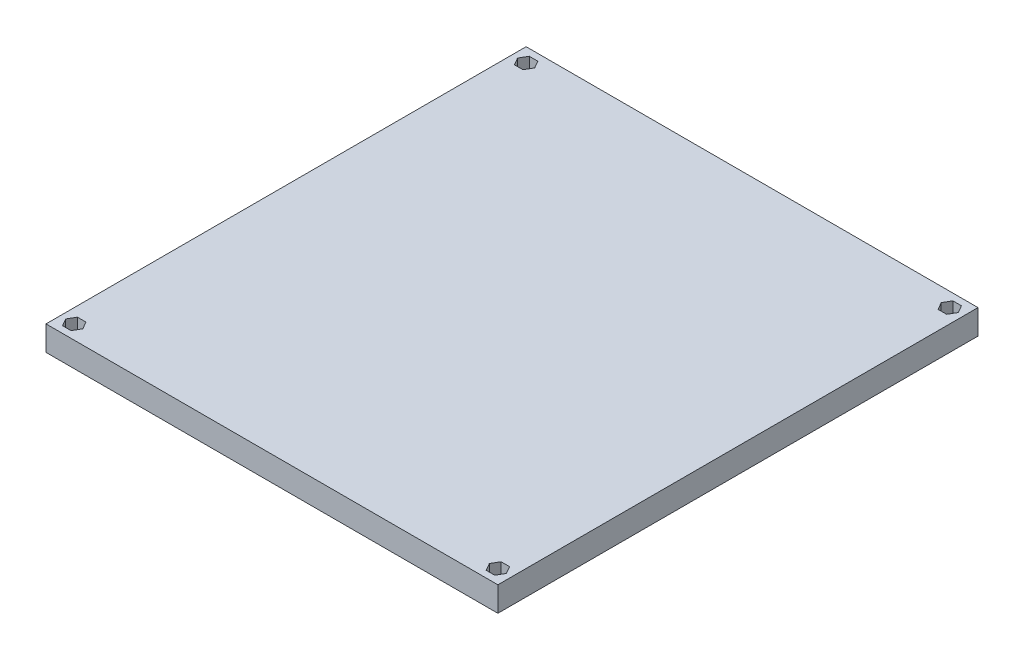
ISO-10303-21;
HEADER;
FILE_DESCRIPTION(('STEP AP214'),'2;1');
FILE_NAME('part.step','',(''),(''),'','','');
FILE_SCHEMA(('AUTOMOTIVE_DESIGN { 1 0 10303 214 1 1 1 1 }'));
ENDSEC;
DATA;
#1=APPLICATION_CONTEXT('core data for automotive mechanical design processes');
#2=APPLICATION_PROTOCOL_DEFINITION('international standard','automotive_design',2000,#1);
#3=PRODUCT_CONTEXT('',#1,'mechanical');
#4=PRODUCT('Part','Part','',(#3));
#5=PRODUCT_RELATED_PRODUCT_CATEGORY('part','',(#4));
#6=PRODUCT_DEFINITION_FORMATION('','',#4);
#7=PRODUCT_DEFINITION_CONTEXT('part definition',#1,'design');
#8=PRODUCT_DEFINITION('design','',#6,#7);
#9=PRODUCT_DEFINITION_SHAPE('','',#8);
#10=(LENGTH_UNIT() NAMED_UNIT(*) SI_UNIT(.MILLI.,.METRE.));
#11=(NAMED_UNIT(*) PLANE_ANGLE_UNIT() SI_UNIT($,.RADIAN.));
#12=(NAMED_UNIT(*) SI_UNIT($,.STERADIAN.) SOLID_ANGLE_UNIT());
#13=UNCERTAINTY_MEASURE_WITH_UNIT(LENGTH_MEASURE(1.E-05),#10,'distance_accuracy_value','');
#14=(GEOMETRIC_REPRESENTATION_CONTEXT(3) GLOBAL_UNCERTAINTY_ASSIGNED_CONTEXT((#13)) GLOBAL_UNIT_ASSIGNED_CONTEXT((#10,
#11,#12)) REPRESENTATION_CONTEXT('',''));
#15=CARTESIAN_POINT('',(0.,0.,0.));
#16=DIRECTION('',(0.,0.,1.));
#17=DIRECTION('',(1.,0.,0.));
#18=AXIS2_PLACEMENT_3D('',#15,#16,#17);
#19=CARTESIAN_POINT('',(0.,3.5,0.));
#20=DIRECTION('',(1.,0.,0.));
#21=DIRECTION('',(0.,0.,-1.));
#22=AXIS2_PLACEMENT_3D('',#19,#20,#21);
#23=PLANE('',#22);
#24=DIRECTION('',(0.,0.,1.));
#25=VECTOR('',#24,1.);
#26=CARTESIAN_POINT('',(0.,0.,0.));
#27=LINE('',#26,#25);
#28=CARTESIAN_POINT('',(0.,0.,0.));
#29=VERTEX_POINT('',#28);
#30=CARTESIAN_POINT('',(0.,0.,68.));
#31=VERTEX_POINT('',#30);
#32=EDGE_CURVE('E399',#29,#31,#27,.T.);
#33=ORIENTED_EDGE('',*,*,#32,.T.);
#34=DIRECTION('',(0.,-1.,0.));
#35=VECTOR('',#34,1.);
#36=CARTESIAN_POINT('',(0.,3.5,68.));
#37=LINE('',#36,#35);
#38=CARTESIAN_POINT('',(0.,3.5,68.));
#39=VERTEX_POINT('',#38);
#40=EDGE_CURVE('E11',#39,#31,#37,.T.);
#41=ORIENTED_EDGE('',*,*,#40,.F.);
#42=DIRECTION('',(0.,0.,1.));
#43=VECTOR('',#42,1.);
#44=CARTESIAN_POINT('',(0.,3.5,0.));
#45=LINE('',#44,#43);
#46=CARTESIAN_POINT('',(0.,3.5,0.));
#47=VERTEX_POINT('',#46);
#48=EDGE_CURVE('E410',#47,#39,#45,.T.);
#49=ORIENTED_EDGE('',*,*,#48,.F.);
#50=DIRECTION('',(0.,-1.,0.));
#51=VECTOR('',#50,1.);
#52=CARTESIAN_POINT('',(0.,3.5,0.));
#53=LINE('',#52,#51);
#54=EDGE_CURVE('E420',#47,#29,#53,.T.);
#55=ORIENTED_EDGE('',*,*,#54,.T.);
#56=EDGE_LOOP('',(#33,#41,#49,#55));
#57=FACE_BOUND('',#56,.T.);
#58=ADVANCED_FACE('F38',(#57),#23,.F.);
#59=CARTESIAN_POINT('',(0.,3.5,68.));
#60=DIRECTION('',(0.,0.,-1.));
#61=DIRECTION('',(-1.,0.,0.));
#62=AXIS2_PLACEMENT_3D('',#59,#60,#61);
#63=PLANE('',#62);
#64=DIRECTION('',(1.,0.,0.));
#65=VECTOR('',#64,1.);
#66=CARTESIAN_POINT('',(0.,0.,68.));
#67=LINE('',#66,#65);
#68=CARTESIAN_POINT('',(64.,0.,68.));
#69=VERTEX_POINT('',#68);
#70=EDGE_CURVE('E423',#31,#69,#67,.T.);
#71=ORIENTED_EDGE('',*,*,#70,.T.);
#72=DIRECTION('',(0.,-1.,0.));
#73=VECTOR('',#72,1.);
#74=CARTESIAN_POINT('',(64.,3.5,68.));
#75=LINE('',#74,#73);
#76=CARTESIAN_POINT('',(64.,3.5,68.));
#77=VERTEX_POINT('',#76);
#78=EDGE_CURVE('E45',#77,#69,#75,.T.);
#79=ORIENTED_EDGE('',*,*,#78,.F.);
#80=DIRECTION('',(1.,0.,0.));
#81=VECTOR('',#80,1.);
#82=CARTESIAN_POINT('',(0.,3.5,68.));
#83=LINE('',#82,#81);
#84=EDGE_CURVE('E413',#39,#77,#83,.T.);
#85=ORIENTED_EDGE('',*,*,#84,.F.);
#86=ORIENTED_EDGE('',*,*,#40,.T.);
#87=EDGE_LOOP('',(#71,#79,#85,#86));
#88=FACE_BOUND('',#87,.T.);
#89=ADVANCED_FACE('F452',(#88),#63,.F.);
#90=CARTESIAN_POINT('',(64.,3.5,0.));
#91=DIRECTION('',(-1.,0.,0.));
#92=DIRECTION('',(0.,0.,1.));
#93=AXIS2_PLACEMENT_3D('',#90,#91,#92);
#94=PLANE('',#93);
#95=DIRECTION('',(0.,0.,-1.));
#96=VECTOR('',#95,1.);
#97=CARTESIAN_POINT('',(64.,0.,0.));
#98=LINE('',#97,#96);
#99=CARTESIAN_POINT('',(64.,0.,0.));
#100=VERTEX_POINT('',#99);
#101=EDGE_CURVE('E425',#69,#100,#98,.T.);
#102=ORIENTED_EDGE('',*,*,#101,.T.);
#103=DIRECTION('',(0.,-1.,0.));
#104=VECTOR('',#103,1.);
#105=CARTESIAN_POINT('',(64.,3.5,0.));
#106=LINE('',#105,#104);
#107=CARTESIAN_POINT('',(64.,3.5,0.));
#108=VERTEX_POINT('',#107);
#109=EDGE_CURVE('E430',#108,#100,#106,.T.);
#110=ORIENTED_EDGE('',*,*,#109,.F.);
#111=DIRECTION('',(0.,0.,-1.));
#112=VECTOR('',#111,1.);
#113=CARTESIAN_POINT('',(64.,3.5,0.));
#114=LINE('',#113,#112);
#115=EDGE_CURVE('E416',#77,#108,#114,.T.);
#116=ORIENTED_EDGE('',*,*,#115,.F.);
#117=ORIENTED_EDGE('',*,*,#78,.T.);
#118=EDGE_LOOP('',(#102,#110,#116,#117));
#119=FACE_BOUND('',#118,.T.);
#120=ADVANCED_FACE('F437',(#119),#94,.F.);
#121=CARTESIAN_POINT('',(0.,3.5,0.));
#122=DIRECTION('',(0.,0.,1.));
#123=DIRECTION('',(1.,0.,0.));
#124=AXIS2_PLACEMENT_3D('',#121,#122,#123);
#125=PLANE('',#124);
#126=DIRECTION('',(-1.,0.,0.));
#127=VECTOR('',#126,1.);
#128=CARTESIAN_POINT('',(0.,0.,0.));
#129=LINE('',#128,#127);
#130=EDGE_CURVE('E414',#100,#29,#129,.T.);
#131=ORIENTED_EDGE('',*,*,#130,.T.);
#132=ORIENTED_EDGE('',*,*,#54,.F.);
#133=DIRECTION('',(-1.,0.,0.));
#134=VECTOR('',#133,1.);
#135=CARTESIAN_POINT('',(0.,3.5,0.));
#136=LINE('',#135,#134);
#137=EDGE_CURVE('E418',#108,#47,#136,.T.);
#138=ORIENTED_EDGE('',*,*,#137,.F.);
#139=ORIENTED_EDGE('',*,*,#109,.T.);
#140=EDGE_LOOP('',(#131,#132,#138,#139));
#141=FACE_BOUND('',#140,.T.);
#142=ADVANCED_FACE('F446',(#141),#125,.F.);
#143=CARTESIAN_POINT('',(0.,3.5,0.));
#144=DIRECTION('',(0.,1.,0.));
#145=DIRECTION('',(0.,0.,1.));
#146=AXIS2_PLACEMENT_3D('',#143,#144,#145);
#147=PLANE('',#146);
#148=DIRECTION('',(0.499999999999998,0.,-0.86602540378444));
#149=VECTOR('',#148,1.);
#150=CARTESIAN_POINT('',(2.60621778264911,3.5,67.05));
#151=LINE('',#150,#149);
#152=CARTESIAN_POINT('',(2.60621778264911,3.5,67.05));
#153=VERTEX_POINT('',#152);
#154=CARTESIAN_POINT('',(3.21243556529821,3.5,66.));
#155=VERTEX_POINT('',#154);
#156=EDGE_CURVE('E52',#153,#155,#151,.T.);
#157=ORIENTED_EDGE('',*,*,#156,.F.);
#158=DIRECTION('',(1.,0.,0.));
#159=VECTOR('',#158,1.);
#160=CARTESIAN_POINT('',(1.3937822173509,3.5,67.05));
#161=LINE('',#160,#159);
#162=CARTESIAN_POINT('',(1.3937822173509,3.5,67.05));
#163=VERTEX_POINT('',#162);
#164=EDGE_CURVE('E331',#163,#153,#161,.T.);
#165=ORIENTED_EDGE('',*,*,#164,.F.);
#166=DIRECTION('',(0.500000000000002,0.,0.866025403784437));
#167=VECTOR('',#166,1.);
#168=CARTESIAN_POINT('',(0.787564434701783,3.5,66.));
#169=LINE('',#168,#167);
#170=CARTESIAN_POINT('',(0.787564434701783,3.5,66.));
#171=VERTEX_POINT('',#170);
#172=EDGE_CURVE('E334',#171,#163,#169,.T.);
#173=ORIENTED_EDGE('',*,*,#172,.F.);
#174=DIRECTION('',(-0.499999999999998,0.,0.86602540378444));
#175=VECTOR('',#174,1.);
#176=CARTESIAN_POINT('',(1.39378221735089,3.5,64.95));
#177=LINE('',#176,#175);
#178=CARTESIAN_POINT('',(1.39378221735089,3.5,64.95));
#179=VERTEX_POINT('',#178);
#180=EDGE_CURVE('E338',#179,#171,#177,.T.);
#181=ORIENTED_EDGE('',*,*,#180,.F.);
#182=DIRECTION('',(-1.,0.,0.));
#183=VECTOR('',#182,1.);
#184=CARTESIAN_POINT('',(2.60621778264909,3.5,64.95));
#185=LINE('',#184,#183);
#186=CARTESIAN_POINT('',(2.60621778264909,3.5,64.95));
#187=VERTEX_POINT('',#186);
#188=EDGE_CURVE('E341',#187,#179,#185,.T.);
#189=ORIENTED_EDGE('',*,*,#188,.F.);
#190=DIRECTION('',(-0.500000000000002,0.,-0.866025403784438));
#191=VECTOR('',#190,1.);
#192=CARTESIAN_POINT('',(3.21243556529821,3.5,66.));
#193=LINE('',#192,#191);
#194=EDGE_CURVE('E344',#155,#187,#193,.T.);
#195=ORIENTED_EDGE('',*,*,#194,.F.);
#196=EDGE_LOOP('',(#157,#165,#173,#181,#189,#195));
#197=FACE_BOUND('',#196,.T.);
#198=DIRECTION('',(-0.499999999999999,0.,0.866025403784439));
#199=VECTOR('',#198,1.);
#200=CARTESIAN_POINT('',(61.3937822173509,3.5,64.95));
#201=LINE('',#200,#199);
#202=CARTESIAN_POINT('',(61.3937822173509,3.5,64.95));
#203=VERTEX_POINT('',#202);
#204=CARTESIAN_POINT('',(60.7875644347018,3.5,66.));
#205=VERTEX_POINT('',#204);
#206=EDGE_CURVE('E60',#203,#205,#201,.T.);
#207=ORIENTED_EDGE('',*,*,#206,.F.);
#208=DIRECTION('',(-1.,0.,0.));
#209=VECTOR('',#208,1.);
#210=CARTESIAN_POINT('',(62.6062177826491,3.5,64.95));
#211=LINE('',#210,#209);
#212=CARTESIAN_POINT('',(62.6062177826491,3.5,64.95));
#213=VERTEX_POINT('',#212);
#214=EDGE_CURVE('E285',#213,#203,#211,.T.);
#215=ORIENTED_EDGE('',*,*,#214,.F.);
#216=DIRECTION('',(-0.499999999999995,0.,-0.866025403784441));
#217=VECTOR('',#216,1.);
#218=CARTESIAN_POINT('',(63.2124355652982,3.5,66.));
#219=LINE('',#218,#217);
#220=CARTESIAN_POINT('',(63.2124355652982,3.5,66.));
#221=VERTEX_POINT('',#220);
#222=EDGE_CURVE('E288',#221,#213,#219,.T.);
#223=ORIENTED_EDGE('',*,*,#222,.F.);
#224=DIRECTION('',(0.5,0.,-0.866025403784439));
#225=VECTOR('',#224,1.);
#226=CARTESIAN_POINT('',(62.6062177826491,3.5,67.05));
#227=LINE('',#226,#225);
#228=CARTESIAN_POINT('',(62.6062177826491,3.5,67.05));
#229=VERTEX_POINT('',#228);
#230=EDGE_CURVE('E292',#229,#221,#227,.T.);
#231=ORIENTED_EDGE('',*,*,#230,.F.);
#232=DIRECTION('',(1.,0.,0.));
#233=VECTOR('',#232,1.);
#234=CARTESIAN_POINT('',(61.3937822173509,3.5,67.05));
#235=LINE('',#234,#233);
#236=CARTESIAN_POINT('',(61.3937822173509,3.5,67.05));
#237=VERTEX_POINT('',#236);
#238=EDGE_CURVE('E295',#237,#229,#235,.T.);
#239=ORIENTED_EDGE('',*,*,#238,.F.);
#240=DIRECTION('',(0.5,0.,0.866025403784439));
#241=VECTOR('',#240,1.);
#242=CARTESIAN_POINT('',(60.7875644347018,3.5,66.));
#243=LINE('',#242,#241);
#244=EDGE_CURVE('E298',#205,#237,#243,.T.);
#245=ORIENTED_EDGE('',*,*,#244,.F.);
#246=EDGE_LOOP('',(#207,#215,#223,#231,#239,#245));
#247=FACE_BOUND('',#246,.T.);
#248=DIRECTION('',(-0.5,0.,0.866025403784439));
#249=VECTOR('',#248,1.);
#250=CARTESIAN_POINT('',(61.3937822173509,3.5,0.95));
#251=LINE('',#250,#249);
#252=CARTESIAN_POINT('',(61.3937822173509,3.5,0.95));
#253=VERTEX_POINT('',#252);
#254=CARTESIAN_POINT('',(60.7875644347018,3.5,2.00000000000001));
#255=VERTEX_POINT('',#254);
#256=EDGE_CURVE('E225',#253,#255,#251,.T.);
#257=ORIENTED_EDGE('',*,*,#256,.F.);
#258=DIRECTION('',(-1.,0.,0.));
#259=VECTOR('',#258,1.);
#260=CARTESIAN_POINT('',(62.6062177826491,3.5,0.95));
#261=LINE('',#260,#259);
#262=CARTESIAN_POINT('',(62.6062177826491,3.5,0.95));
#263=VERTEX_POINT('',#262);
#264=EDGE_CURVE('E235',#263,#253,#261,.T.);
#265=ORIENTED_EDGE('',*,*,#264,.F.);
#266=DIRECTION('',(-0.499999999999997,0.,-0.86602540378444));
#267=VECTOR('',#266,1.);
#268=CARTESIAN_POINT('',(63.2124355652982,3.5,2.));
#269=LINE('',#268,#267);
#270=CARTESIAN_POINT('',(63.2124355652982,3.5,2.));
#271=VERTEX_POINT('',#270);
#272=EDGE_CURVE('E240',#271,#263,#269,.T.);
#273=ORIENTED_EDGE('',*,*,#272,.F.);
#274=DIRECTION('',(0.499999999999999,0.,-0.866025403784439));
#275=VECTOR('',#274,1.);
#276=CARTESIAN_POINT('',(62.6062177826491,3.5,3.05));
#277=LINE('',#276,#275);
#278=CARTESIAN_POINT('',(62.6062177826491,3.5,3.05));
#279=VERTEX_POINT('',#278);
#280=EDGE_CURVE('E780',#279,#271,#277,.T.);
#281=ORIENTED_EDGE('',*,*,#280,.F.);
#282=DIRECTION('',(1.,0.,0.));
#283=VECTOR('',#282,1.);
#284=CARTESIAN_POINT('',(61.3937822173509,3.5,3.05));
#285=LINE('',#284,#283);
#286=CARTESIAN_POINT('',(61.3937822173509,3.5,3.05));
#287=VERTEX_POINT('',#286);
#288=EDGE_CURVE('E252',#287,#279,#285,.T.);
#289=ORIENTED_EDGE('',*,*,#288,.F.);
#290=DIRECTION('',(0.499999999999997,0.,0.86602540378444));
#291=VECTOR('',#290,1.);
#292=CARTESIAN_POINT('',(60.7875644347018,3.5,2.00000000000001));
#293=LINE('',#292,#291);
#294=EDGE_CURVE('E247',#255,#287,#293,.T.);
#295=ORIENTED_EDGE('',*,*,#294,.F.);
#296=EDGE_LOOP('',(#257,#265,#273,#281,#289,#295));
#297=FACE_BOUND('',#296,.T.);
#298=DIRECTION('',(0.5,0.,-0.866025403784439));
#299=VECTOR('',#298,1.);
#300=CARTESIAN_POINT('',(2.60621778264911,3.5,3.05));
#301=LINE('',#300,#299);
#302=CARTESIAN_POINT('',(2.60621778264911,3.5,3.05));
#303=VERTEX_POINT('',#302);
#304=CARTESIAN_POINT('',(3.21243556529821,3.5,2.));
#305=VERTEX_POINT('',#304);
#306=EDGE_CURVE('E248',#303,#305,#301,.T.);
#307=ORIENTED_EDGE('',*,*,#306,.F.);
#308=DIRECTION('',(1.,0.,0.));
#309=VECTOR('',#308,1.);
#310=CARTESIAN_POINT('',(1.39378221735089,3.5,3.05));
#311=LINE('',#310,#309);
#312=CARTESIAN_POINT('',(1.39378221735089,3.5,3.05));
#313=VERTEX_POINT('',#312);
#314=EDGE_CURVE('E368',#313,#303,#311,.T.);
#315=ORIENTED_EDGE('',*,*,#314,.F.);
#316=DIRECTION('',(0.5,0.,0.866025403784439));
#317=VECTOR('',#316,1.);
#318=CARTESIAN_POINT('',(0.787564434701786,3.5,2.));
#319=LINE('',#318,#317);
#320=CARTESIAN_POINT('',(0.787564434701786,3.5,2.));
#321=VERTEX_POINT('',#320);
#322=EDGE_CURVE('E392',#321,#313,#319,.T.);
#323=ORIENTED_EDGE('',*,*,#322,.F.);
#324=DIRECTION('',(-0.5,0.,0.866025403784439));
#325=VECTOR('',#324,1.);
#326=CARTESIAN_POINT('',(1.39378221735089,3.5,0.949999999999999));
#327=LINE('',#326,#325);
#328=CARTESIAN_POINT('',(1.39378221735089,3.5,0.949999999999999));
#329=VERTEX_POINT('',#328);
#330=EDGE_CURVE('E389',#329,#321,#327,.T.);
#331=ORIENTED_EDGE('',*,*,#330,.F.);
#332=DIRECTION('',(-1.,0.,0.));
#333=VECTOR('',#332,1.);
#334=CARTESIAN_POINT('',(2.60621778264911,3.5,0.95));
#335=LINE('',#334,#333);
#336=CARTESIAN_POINT('',(2.60621778264911,3.5,0.95));
#337=VERTEX_POINT('',#336);
#338=EDGE_CURVE('E386',#337,#329,#335,.T.);
#339=ORIENTED_EDGE('',*,*,#338,.F.);
#340=DIRECTION('',(-0.5,0.,-0.866025403784439));
#341=VECTOR('',#340,1.);
#342=CARTESIAN_POINT('',(3.21243556529821,3.5,2.));
#343=LINE('',#342,#341);
#344=EDGE_CURVE('E250',#305,#337,#343,.T.);
#345=ORIENTED_EDGE('',*,*,#344,.F.);
#346=EDGE_LOOP('',(#307,#315,#323,#331,#339,#345));
#347=FACE_BOUND('',#346,.T.);
#348=ORIENTED_EDGE('',*,*,#48,.T.);
#349=ORIENTED_EDGE('',*,*,#84,.T.);
#350=ORIENTED_EDGE('',*,*,#115,.T.);
#351=ORIENTED_EDGE('',*,*,#137,.T.);
#352=EDGE_LOOP('',(#348,#349,#350,#351));
#353=FACE_BOUND('',#352,.T.);
#354=ADVANCED_FACE('F243',(#197,#247,#297,#347,#353),#147,.T.);
#355=CARTESIAN_POINT('',(0.,0.,0.));
#356=DIRECTION('',(0.,1.,0.));
#357=DIRECTION('',(0.,0.,1.));
#358=AXIS2_PLACEMENT_3D('',#355,#356,#357);
#359=PLANE('',#358);
#360=ORIENTED_EDGE('',*,*,#32,.F.);
#361=ORIENTED_EDGE('',*,*,#130,.F.);
#362=ORIENTED_EDGE('',*,*,#101,.F.);
#363=ORIENTED_EDGE('',*,*,#70,.F.);
#364=EDGE_LOOP('',(#360,#361,#362,#363));
#365=FACE_BOUND('',#364,.T.);
#366=ADVANCED_FACE('F443',(#365),#359,.F.);
#367=CARTESIAN_POINT('',(2.60621778264911,1.2,3.05));
#368=DIRECTION('',(0.866025403784439,0.,0.5));
#369=DIRECTION('',(0.5,0.,-0.866025403784439));
#370=AXIS2_PLACEMENT_3D('',#367,#368,#369);
#371=PLANE('',#370);
#372=ORIENTED_EDGE('',*,*,#306,.T.);
#373=DIRECTION('',(0.,1.,0.));
#374=VECTOR('',#373,1.);
#375=CARTESIAN_POINT('',(3.21243556529821,1.2,2.));
#376=LINE('',#375,#374);
#377=CARTESIAN_POINT('',(3.21243556529821,1.2,2.));
#378=VERTEX_POINT('',#377);
#379=EDGE_CURVE('E382',#378,#305,#376,.T.);
#380=ORIENTED_EDGE('',*,*,#379,.F.);
#381=DIRECTION('',(0.5,0.,-0.866025403784439));
#382=VECTOR('',#381,1.);
#383=CARTESIAN_POINT('',(2.60621778264911,1.2,3.05));
#384=LINE('',#383,#382);
#385=CARTESIAN_POINT('',(2.60621778264911,1.2,3.05));
#386=VERTEX_POINT('',#385);
#387=EDGE_CURVE('E364',#386,#378,#384,.T.);
#388=ORIENTED_EDGE('',*,*,#387,.F.);
#389=DIRECTION('',(0.,1.,0.));
#390=VECTOR('',#389,1.);
#391=CARTESIAN_POINT('',(2.60621778264911,1.2,3.05));
#392=LINE('',#391,#390);
#393=EDGE_CURVE('E397',#386,#303,#392,.T.);
#394=ORIENTED_EDGE('',*,*,#393,.T.);
#395=EDGE_LOOP('',(#372,#380,#388,#394));
#396=FACE_BOUND('',#395,.T.);
#397=ADVANCED_FACE('F464',(#396),#371,.F.);
#398=CARTESIAN_POINT('',(1.39378221735089,1.2,3.05));
#399=DIRECTION('',(0.,0.,1.));
#400=DIRECTION('',(1.,0.,0.));
#401=AXIS2_PLACEMENT_3D('',#398,#399,#400);
#402=PLANE('',#401);
#403=ORIENTED_EDGE('',*,*,#314,.T.);
#404=ORIENTED_EDGE('',*,*,#393,.F.);
#405=DIRECTION('',(1.,0.,0.));
#406=VECTOR('',#405,1.);
#407=CARTESIAN_POINT('',(1.39378221735089,1.2,3.05));
#408=LINE('',#407,#406);
#409=CARTESIAN_POINT('',(1.39378221735089,1.2,3.05));
#410=VERTEX_POINT('',#409);
#411=EDGE_CURVE('E380',#410,#386,#408,.T.);
#412=ORIENTED_EDGE('',*,*,#411,.F.);
#413=DIRECTION('',(0.,1.,0.));
#414=VECTOR('',#413,1.);
#415=CARTESIAN_POINT('',(1.39378221735089,1.2,3.05));
#416=LINE('',#415,#414);
#417=EDGE_CURVE('E400',#410,#313,#416,.T.);
#418=ORIENTED_EDGE('',*,*,#417,.T.);
#419=EDGE_LOOP('',(#403,#404,#412,#418));
#420=FACE_BOUND('',#419,.T.);
#421=ADVANCED_FACE('F470',(#420),#402,.F.);
#422=CARTESIAN_POINT('',(0.787564434701786,1.2,2.));
#423=DIRECTION('',(-0.866025403784439,0.,0.5));
#424=DIRECTION('',(0.5,0.,0.866025403784439));
#425=AXIS2_PLACEMENT_3D('',#422,#423,#424);
#426=PLANE('',#425);
#427=ORIENTED_EDGE('',*,*,#322,.T.);
#428=ORIENTED_EDGE('',*,*,#417,.F.);
#429=DIRECTION('',(0.5,0.,0.866025403784439));
#430=VECTOR('',#429,1.);
#431=CARTESIAN_POINT('',(0.787564434701786,1.2,2.));
#432=LINE('',#431,#430);
#433=CARTESIAN_POINT('',(0.787564434701786,1.2,2.));
#434=VERTEX_POINT('',#433);
#435=EDGE_CURVE('E377',#434,#410,#432,.T.);
#436=ORIENTED_EDGE('',*,*,#435,.F.);
#437=DIRECTION('',(0.,1.,0.));
#438=VECTOR('',#437,1.);
#439=CARTESIAN_POINT('',(0.787564434701786,1.2,2.));
#440=LINE('',#439,#438);
#441=EDGE_CURVE('E402',#434,#321,#440,.T.);
#442=ORIENTED_EDGE('',*,*,#441,.T.);
#443=EDGE_LOOP('',(#427,#428,#436,#442));
#444=FACE_BOUND('',#443,.T.);
#445=ADVANCED_FACE('F484',(#444),#426,.F.);
#446=CARTESIAN_POINT('',(1.39378221735089,1.2,0.949999999999999));
#447=DIRECTION('',(-0.866025403784439,0.,-0.5));
#448=DIRECTION('',(-0.5,0.,0.866025403784439));
#449=AXIS2_PLACEMENT_3D('',#446,#447,#448);
#450=PLANE('',#449);
#451=ORIENTED_EDGE('',*,*,#330,.T.);
#452=ORIENTED_EDGE('',*,*,#441,.F.);
#453=DIRECTION('',(-0.5,0.,0.866025403784439));
#454=VECTOR('',#453,1.);
#455=CARTESIAN_POINT('',(1.39378221735089,1.2,0.949999999999999));
#456=LINE('',#455,#454);
#457=CARTESIAN_POINT('',(1.39378221735089,1.2,0.949999999999999));
#458=VERTEX_POINT('',#457);
#459=EDGE_CURVE('E374',#458,#434,#456,.T.);
#460=ORIENTED_EDGE('',*,*,#459,.F.);
#461=DIRECTION('',(0.,1.,0.));
#462=VECTOR('',#461,1.);
#463=CARTESIAN_POINT('',(1.39378221735089,1.2,0.949999999999999));
#464=LINE('',#463,#462);
#465=EDGE_CURVE('E404',#458,#329,#464,.T.);
#466=ORIENTED_EDGE('',*,*,#465,.T.);
#467=EDGE_LOOP('',(#451,#452,#460,#466));
#468=FACE_BOUND('',#467,.T.);
#469=ADVANCED_FACE('F480',(#468),#450,.F.);
#470=CARTESIAN_POINT('',(2.60621778264911,1.2,0.95));
#471=DIRECTION('',(0.,0.,-1.));
#472=DIRECTION('',(-1.,0.,0.));
#473=AXIS2_PLACEMENT_3D('',#470,#471,#472);
#474=PLANE('',#473);
#475=ORIENTED_EDGE('',*,*,#338,.T.);
#476=ORIENTED_EDGE('',*,*,#465,.F.);
#477=DIRECTION('',(-1.,0.,0.));
#478=VECTOR('',#477,1.);
#479=CARTESIAN_POINT('',(2.60621778264911,1.2,0.95));
#480=LINE('',#479,#478);
#481=CARTESIAN_POINT('',(2.60621778264911,1.2,0.95));
#482=VERTEX_POINT('',#481);
#483=EDGE_CURVE('E371',#482,#458,#480,.T.);
#484=ORIENTED_EDGE('',*,*,#483,.F.);
#485=DIRECTION('',(0.,1.,0.));
#486=VECTOR('',#485,1.);
#487=CARTESIAN_POINT('',(2.60621778264911,1.2,0.95));
#488=LINE('',#487,#486);
#489=EDGE_CURVE('E406',#482,#337,#488,.T.);
#490=ORIENTED_EDGE('',*,*,#489,.T.);
#491=EDGE_LOOP('',(#475,#476,#484,#490));
#492=FACE_BOUND('',#491,.T.);
#493=ADVANCED_FACE('F476',(#492),#474,.F.);
#494=CARTESIAN_POINT('',(3.21243556529821,1.2,2.));
#495=DIRECTION('',(0.866025403784439,0.,-0.5));
#496=DIRECTION('',(-0.5,0.,-0.866025403784439));
#497=AXIS2_PLACEMENT_3D('',#494,#495,#496);
#498=PLANE('',#497);
#499=ORIENTED_EDGE('',*,*,#344,.T.);
#500=ORIENTED_EDGE('',*,*,#489,.F.);
#501=DIRECTION('',(-0.5,0.,-0.866025403784439));
#502=VECTOR('',#501,1.);
#503=CARTESIAN_POINT('',(3.21243556529821,1.2,2.));
#504=LINE('',#503,#502);
#505=EDGE_CURVE('E367',#378,#482,#504,.T.);
#506=ORIENTED_EDGE('',*,*,#505,.F.);
#507=ORIENTED_EDGE('',*,*,#379,.T.);
#508=EDGE_LOOP('',(#499,#500,#506,#507));
#509=FACE_BOUND('',#508,.T.);
#510=ADVANCED_FACE('F472',(#509),#498,.F.);
#511=CARTESIAN_POINT('',(0.,1.2,0.));
#512=DIRECTION('',(0.,1.,0.));
#513=DIRECTION('',(0.,0.,1.));
#514=AXIS2_PLACEMENT_3D('',#511,#512,#513);
#515=PLANE('',#514);
#516=ORIENTED_EDGE('',*,*,#387,.T.);
#517=ORIENTED_EDGE('',*,*,#505,.T.);
#518=ORIENTED_EDGE('',*,*,#483,.T.);
#519=ORIENTED_EDGE('',*,*,#459,.T.);
#520=ORIENTED_EDGE('',*,*,#435,.T.);
#521=ORIENTED_EDGE('',*,*,#411,.T.);
#522=EDGE_LOOP('',(#516,#517,#518,#519,#520,#521));
#523=FACE_BOUND('',#522,.T.);
#524=ADVANCED_FACE('F475',(#523),#515,.T.);
#525=CARTESIAN_POINT('',(61.3937822173509,1.2,0.95));
#526=DIRECTION('',(-0.866025403784439,0.,-0.5));
#527=DIRECTION('',(-0.5,0.,0.866025403784439));
#528=AXIS2_PLACEMENT_3D('',#525,#526,#527);
#529=PLANE('',#528);
#530=ORIENTED_EDGE('',*,*,#256,.T.);
#531=DIRECTION('',(0.,1.,0.));
#532=VECTOR('',#531,1.);
#533=CARTESIAN_POINT('',(60.7875644347018,1.2,2.00000000000001));
#534=LINE('',#533,#532);
#535=CARTESIAN_POINT('',(60.7875644347018,1.2,2.00000000000001));
#536=VERTEX_POINT('',#535);
#537=EDGE_CURVE('E259',#536,#255,#534,.T.);
#538=ORIENTED_EDGE('',*,*,#537,.F.);
#539=DIRECTION('',(-0.5,0.,0.866025403784439));
#540=VECTOR('',#539,1.);
#541=CARTESIAN_POINT('',(61.3937822173509,1.2,0.95));
#542=LINE('',#541,#540);
#543=CARTESIAN_POINT('',(61.3937822173509,1.2,0.95));
#544=VERTEX_POINT('',#543);
#545=EDGE_CURVE('E228',#544,#536,#542,.T.);
#546=ORIENTED_EDGE('',*,*,#545,.F.);
#547=DIRECTION('',(0.,1.,0.));
#548=VECTOR('',#547,1.);
#549=CARTESIAN_POINT('',(61.3937822173509,1.2,0.95));
#550=LINE('',#549,#548);
#551=EDGE_CURVE('E221',#544,#253,#550,.T.);
#552=ORIENTED_EDGE('',*,*,#551,.T.);
#553=EDGE_LOOP('',(#530,#538,#546,#552));
#554=FACE_BOUND('',#553,.T.);
#555=ADVANCED_FACE('F223',(#554),#529,.F.);
#556=CARTESIAN_POINT('',(62.6062177826491,1.2,0.95));
#557=DIRECTION('',(0.,0.,-1.));
#558=DIRECTION('',(-1.,0.,0.));
#559=AXIS2_PLACEMENT_3D('',#556,#557,#558);
#560=PLANE('',#559);
#561=ORIENTED_EDGE('',*,*,#264,.T.);
#562=ORIENTED_EDGE('',*,*,#551,.F.);
#563=DIRECTION('',(-1.,0.,0.));
#564=VECTOR('',#563,1.);
#565=CARTESIAN_POINT('',(62.6062177826491,1.2,0.95));
#566=LINE('',#565,#564);
#567=CARTESIAN_POINT('',(62.6062177826491,1.2,0.95));
#568=VERTEX_POINT('',#567);
#569=EDGE_CURVE('E256',#568,#544,#566,.T.);
#570=ORIENTED_EDGE('',*,*,#569,.F.);
#571=DIRECTION('',(0.,1.,0.));
#572=VECTOR('',#571,1.);
#573=CARTESIAN_POINT('',(62.6062177826491,1.2,0.95));
#574=LINE('',#573,#572);
#575=EDGE_CURVE('E232',#568,#263,#574,.T.);
#576=ORIENTED_EDGE('',*,*,#575,.T.);
#577=EDGE_LOOP('',(#561,#562,#570,#576));
#578=FACE_BOUND('',#577,.T.);
#579=ADVANCED_FACE('F236',(#578),#560,.F.);
#580=CARTESIAN_POINT('',(63.2124355652982,1.2,2.));
#581=DIRECTION('',(0.86602540378444,0.,-0.499999999999997));
#582=DIRECTION('',(-0.499999999999997,0.,-0.86602540378444));
#583=AXIS2_PLACEMENT_3D('',#580,#581,#582);
#584=PLANE('',#583);
#585=ORIENTED_EDGE('',*,*,#272,.T.);
#586=ORIENTED_EDGE('',*,*,#575,.F.);
#587=DIRECTION('',(-0.499999999999997,0.,-0.86602540378444));
#588=VECTOR('',#587,1.);
#589=CARTESIAN_POINT('',(63.2124355652982,1.2,2.));
#590=LINE('',#589,#588);
#591=CARTESIAN_POINT('',(63.2124355652982,1.2,2.));
#592=VERTEX_POINT('',#591);
#593=EDGE_CURVE('E258',#592,#568,#590,.T.);
#594=ORIENTED_EDGE('',*,*,#593,.F.);
#595=DIRECTION('',(0.,1.,0.));
#596=VECTOR('',#595,1.);
#597=CARTESIAN_POINT('',(63.2124355652982,1.2,2.));
#598=LINE('',#597,#596);
#599=EDGE_CURVE('E785',#592,#271,#598,.T.);
#600=ORIENTED_EDGE('',*,*,#599,.T.);
#601=EDGE_LOOP('',(#585,#586,#594,#600));
#602=FACE_BOUND('',#601,.T.);
#603=ADVANCED_FACE('F556',(#602),#584,.F.);
#604=CARTESIAN_POINT('',(62.6062177826491,1.2,3.05));
#605=DIRECTION('',(0.866025403784439,0.,0.499999999999999));
#606=DIRECTION('',(0.499999999999999,0.,-0.866025403784439));
#607=AXIS2_PLACEMENT_3D('',#604,#605,#606);
#608=PLANE('',#607);
#609=ORIENTED_EDGE('',*,*,#280,.T.);
#610=ORIENTED_EDGE('',*,*,#599,.F.);
#611=DIRECTION('',(0.499999999999999,0.,-0.866025403784439));
#612=VECTOR('',#611,1.);
#613=CARTESIAN_POINT('',(62.6062177826491,1.2,3.05));
#614=LINE('',#613,#612);
#615=CARTESIAN_POINT('',(62.6062177826491,1.2,3.05));
#616=VERTEX_POINT('',#615);
#617=EDGE_CURVE('E262',#616,#592,#614,.T.);
#618=ORIENTED_EDGE('',*,*,#617,.F.);
#619=DIRECTION('',(0.,1.,0.));
#620=VECTOR('',#619,1.);
#621=CARTESIAN_POINT('',(62.6062177826491,1.2,3.05));
#622=LINE('',#621,#620);
#623=EDGE_CURVE('E787',#616,#279,#622,.T.);
#624=ORIENTED_EDGE('',*,*,#623,.T.);
#625=EDGE_LOOP('',(#609,#610,#618,#624));
#626=FACE_BOUND('',#625,.T.);
#627=ADVANCED_FACE('F559',(#626),#608,.F.);
#628=CARTESIAN_POINT('',(61.3937822173509,1.2,3.05));
#629=DIRECTION('',(0.,0.,1.));
#630=DIRECTION('',(1.,0.,0.));
#631=AXIS2_PLACEMENT_3D('',#628,#629,#630);
#632=PLANE('',#631);
#633=ORIENTED_EDGE('',*,*,#288,.T.);
#634=ORIENTED_EDGE('',*,*,#623,.F.);
#635=DIRECTION('',(1.,0.,0.));
#636=VECTOR('',#635,1.);
#637=CARTESIAN_POINT('',(61.3937822173509,1.2,3.05));
#638=LINE('',#637,#636);
#639=CARTESIAN_POINT('',(61.3937822173509,1.2,3.05));
#640=VERTEX_POINT('',#639);
#641=EDGE_CURVE('E265',#640,#616,#638,.T.);
#642=ORIENTED_EDGE('',*,*,#641,.F.);
#643=DIRECTION('',(0.,1.,0.));
#644=VECTOR('',#643,1.);
#645=CARTESIAN_POINT('',(61.3937822173509,1.2,3.05));
#646=LINE('',#645,#644);
#647=EDGE_CURVE('E775',#640,#287,#646,.T.);
#648=ORIENTED_EDGE('',*,*,#647,.T.);
#649=EDGE_LOOP('',(#633,#634,#642,#648));
#650=FACE_BOUND('',#649,.T.);
#651=ADVANCED_FACE('F563',(#650),#632,.F.);
#652=CARTESIAN_POINT('',(60.7875644347018,1.2,2.00000000000001));
#653=DIRECTION('',(-0.866025403784441,0.,0.499999999999997));
#654=DIRECTION('',(0.499999999999997,0.,0.866025403784441));
#655=AXIS2_PLACEMENT_3D('',#652,#653,#654);
#656=PLANE('',#655);
#657=ORIENTED_EDGE('',*,*,#294,.T.);
#658=ORIENTED_EDGE('',*,*,#647,.F.);
#659=DIRECTION('',(0.499999999999997,0.,0.86602540378444));
#660=VECTOR('',#659,1.);
#661=CARTESIAN_POINT('',(60.7875644347018,1.2,2.00000000000001));
#662=LINE('',#661,#660);
#663=EDGE_CURVE('E268',#536,#640,#662,.T.);
#664=ORIENTED_EDGE('',*,*,#663,.F.);
#665=ORIENTED_EDGE('',*,*,#537,.T.);
#666=EDGE_LOOP('',(#657,#658,#664,#665));
#667=FACE_BOUND('',#666,.T.);
#668=ADVANCED_FACE('F552',(#667),#656,.F.);
#669=CARTESIAN_POINT('',(0.,1.2,0.));
#670=DIRECTION('',(0.,1.,0.));
#671=DIRECTION('',(0.,0.,1.));
#672=AXIS2_PLACEMENT_3D('',#669,#670,#671);
#673=PLANE('',#672);
#674=ORIENTED_EDGE('',*,*,#545,.T.);
#675=ORIENTED_EDGE('',*,*,#663,.T.);
#676=ORIENTED_EDGE('',*,*,#641,.T.);
#677=ORIENTED_EDGE('',*,*,#617,.T.);
#678=ORIENTED_EDGE('',*,*,#593,.T.);
#679=ORIENTED_EDGE('',*,*,#569,.T.);
#680=EDGE_LOOP('',(#674,#675,#676,#677,#678,#679));
#681=FACE_BOUND('',#680,.T.);
#682=ADVANCED_FACE('F549',(#681),#673,.T.);
#683=CARTESIAN_POINT('',(61.3937822173509,1.2,64.95));
#684=DIRECTION('',(-0.866025403784439,0.,-0.499999999999999));
#685=DIRECTION('',(-0.499999999999999,0.,0.866025403784439));
#686=AXIS2_PLACEMENT_3D('',#683,#684,#685);
#687=PLANE('',#686);
#688=ORIENTED_EDGE('',*,*,#206,.T.);
#689=DIRECTION('',(0.,1.,0.));
#690=VECTOR('',#689,1.);
#691=CARTESIAN_POINT('',(60.7875644347018,1.2,66.));
#692=LINE('',#691,#690);
#693=CARTESIAN_POINT('',(60.7875644347018,1.2,66.));
#694=VERTEX_POINT('',#693);
#695=EDGE_CURVE('E272',#694,#205,#692,.T.);
#696=ORIENTED_EDGE('',*,*,#695,.F.);
#697=DIRECTION('',(-0.499999999999999,0.,0.866025403784439));
#698=VECTOR('',#697,1.);
#699=CARTESIAN_POINT('',(61.3937822173509,1.2,64.95));
#700=LINE('',#699,#698);
#701=CARTESIAN_POINT('',(61.3937822173509,1.2,64.95));
#702=VERTEX_POINT('',#701);
#703=EDGE_CURVE('E289',#702,#694,#700,.T.);
#704=ORIENTED_EDGE('',*,*,#703,.F.);
#705=DIRECTION('',(0.,1.,0.));
#706=VECTOR('',#705,1.);
#707=CARTESIAN_POINT('',(61.3937822173509,1.2,64.95));
#708=LINE('',#707,#706);
#709=EDGE_CURVE('E283',#702,#203,#708,.T.);
#710=ORIENTED_EDGE('',*,*,#709,.T.);
#711=EDGE_LOOP('',(#688,#696,#704,#710));
#712=FACE_BOUND('',#711,.T.);
#713=ADVANCED_FACE('F531',(#712),#687,.F.);
#714=CARTESIAN_POINT('',(62.6062177826491,1.2,64.95));
#715=DIRECTION('',(0.,0.,-1.));
#716=DIRECTION('',(-1.,0.,0.));
#717=AXIS2_PLACEMENT_3D('',#714,#715,#716);
#718=PLANE('',#717);
#719=ORIENTED_EDGE('',*,*,#214,.T.);
#720=ORIENTED_EDGE('',*,*,#709,.F.);
#721=DIRECTION('',(-1.,0.,0.));
#722=VECTOR('',#721,1.);
#723=CARTESIAN_POINT('',(62.6062177826491,1.2,64.95));
#724=LINE('',#723,#722);
#725=CARTESIAN_POINT('',(62.6062177826491,1.2,64.95));
#726=VERTEX_POINT('',#725);
#727=EDGE_CURVE('E274',#726,#702,#724,.T.);
#728=ORIENTED_EDGE('',*,*,#727,.F.);
#729=DIRECTION('',(0.,1.,0.));
#730=VECTOR('',#729,1.);
#731=CARTESIAN_POINT('',(62.6062177826491,1.2,64.95));
#732=LINE('',#731,#730);
#733=EDGE_CURVE('E281',#726,#213,#732,.T.);
#734=ORIENTED_EDGE('',*,*,#733,.T.);
#735=EDGE_LOOP('',(#719,#720,#728,#734));
#736=FACE_BOUND('',#735,.T.);
#737=ADVANCED_FACE('F527',(#736),#718,.F.);
#738=CARTESIAN_POINT('',(63.2124355652982,1.2,66.));
#739=DIRECTION('',(0.866025403784441,0.,-0.499999999999995));
#740=DIRECTION('',(-0.499999999999995,0.,-0.866025403784442));
#741=AXIS2_PLACEMENT_3D('',#738,#739,#740);
#742=PLANE('',#741);
#743=ORIENTED_EDGE('',*,*,#222,.T.);
#744=ORIENTED_EDGE('',*,*,#733,.F.);
#745=DIRECTION('',(-0.499999999999995,0.,-0.866025403784441));
#746=VECTOR('',#745,1.);
#747=CARTESIAN_POINT('',(63.2124355652982,1.2,66.));
#748=LINE('',#747,#746);
#749=CARTESIAN_POINT('',(63.2124355652982,1.2,66.));
#750=VERTEX_POINT('',#749);
#751=EDGE_CURVE('E304',#750,#726,#748,.T.);
#752=ORIENTED_EDGE('',*,*,#751,.F.);
#753=DIRECTION('',(0.,1.,0.));
#754=VECTOR('',#753,1.);
#755=CARTESIAN_POINT('',(63.2124355652982,1.2,66.));
#756=LINE('',#755,#754);
#757=EDGE_CURVE('E279',#750,#221,#756,.T.);
#758=ORIENTED_EDGE('',*,*,#757,.T.);
#759=EDGE_LOOP('',(#743,#744,#752,#758));
#760=FACE_BOUND('',#759,.T.);
#761=ADVANCED_FACE('F530',(#760),#742,.F.);
#762=CARTESIAN_POINT('',(62.6062177826491,1.2,67.05));
#763=DIRECTION('',(0.866025403784439,0.,0.5));
#764=DIRECTION('',(0.5,0.,-0.866025403784439));
#765=AXIS2_PLACEMENT_3D('',#762,#763,#764);
#766=PLANE('',#765);
#767=ORIENTED_EDGE('',*,*,#230,.T.);
#768=ORIENTED_EDGE('',*,*,#757,.F.);
#769=DIRECTION('',(0.5,0.,-0.866025403784439));
#770=VECTOR('',#769,1.);
#771=CARTESIAN_POINT('',(62.6062177826491,1.2,67.05));
#772=LINE('',#771,#770);
#773=CARTESIAN_POINT('',(62.6062177826491,1.2,67.05));
#774=VERTEX_POINT('',#773);
#775=EDGE_CURVE('E307',#774,#750,#772,.T.);
#776=ORIENTED_EDGE('',*,*,#775,.F.);
#777=DIRECTION('',(0.,1.,0.));
#778=VECTOR('',#777,1.);
#779=CARTESIAN_POINT('',(62.6062177826491,1.2,67.05));
#780=LINE('',#779,#778);
#781=EDGE_CURVE('E277',#774,#229,#780,.T.);
#782=ORIENTED_EDGE('',*,*,#781,.T.);
#783=EDGE_LOOP('',(#767,#768,#776,#782));
#784=FACE_BOUND('',#783,.T.);
#785=ADVANCED_FACE('F535',(#784),#766,.F.);
#786=CARTESIAN_POINT('',(61.3937822173509,1.2,67.05));
#787=DIRECTION('',(0.,0.,1.));
#788=DIRECTION('',(1.,0.,0.));
#789=AXIS2_PLACEMENT_3D('',#786,#787,#788);
#790=PLANE('',#789);
#791=ORIENTED_EDGE('',*,*,#238,.T.);
#792=ORIENTED_EDGE('',*,*,#781,.F.);
#793=DIRECTION('',(1.,0.,0.));
#794=VECTOR('',#793,1.);
#795=CARTESIAN_POINT('',(61.3937822173509,1.2,67.05));
#796=LINE('',#795,#794);
#797=CARTESIAN_POINT('',(61.3937822173509,1.2,67.05));
#798=VERTEX_POINT('',#797);
#799=EDGE_CURVE('E310',#798,#774,#796,.T.);
#800=ORIENTED_EDGE('',*,*,#799,.F.);
#801=DIRECTION('',(0.,1.,0.));
#802=VECTOR('',#801,1.);
#803=CARTESIAN_POINT('',(61.3937822173509,1.2,67.05));
#804=LINE('',#803,#802);
#805=EDGE_CURVE('E275',#798,#237,#804,.T.);
#806=ORIENTED_EDGE('',*,*,#805,.T.);
#807=EDGE_LOOP('',(#791,#792,#800,#806));
#808=FACE_BOUND('',#807,.T.);
#809=ADVANCED_FACE('F539',(#808),#790,.F.);
#810=CARTESIAN_POINT('',(60.7875644347018,1.2,66.));
#811=DIRECTION('',(-0.866025403784439,0.,0.5));
#812=DIRECTION('',(0.5,0.,0.866025403784439));
#813=AXIS2_PLACEMENT_3D('',#810,#811,#812);
#814=PLANE('',#813);
#815=ORIENTED_EDGE('',*,*,#244,.T.);
#816=ORIENTED_EDGE('',*,*,#805,.F.);
#817=DIRECTION('',(0.5,0.,0.866025403784439));
#818=VECTOR('',#817,1.);
#819=CARTESIAN_POINT('',(60.7875644347018,1.2,66.));
#820=LINE('',#819,#818);
#821=EDGE_CURVE('E313',#694,#798,#820,.T.);
#822=ORIENTED_EDGE('',*,*,#821,.F.);
#823=ORIENTED_EDGE('',*,*,#695,.T.);
#824=EDGE_LOOP('',(#815,#816,#822,#823));
#825=FACE_BOUND('',#824,.T.);
#826=ADVANCED_FACE('F525',(#825),#814,.F.);
#827=CARTESIAN_POINT('',(0.,1.2,0.));
#828=DIRECTION('',(0.,1.,0.));
#829=DIRECTION('',(0.,0.,1.));
#830=AXIS2_PLACEMENT_3D('',#827,#828,#829);
#831=PLANE('',#830);
#832=ORIENTED_EDGE('',*,*,#703,.T.);
#833=ORIENTED_EDGE('',*,*,#821,.T.);
#834=ORIENTED_EDGE('',*,*,#799,.T.);
#835=ORIENTED_EDGE('',*,*,#775,.T.);
#836=ORIENTED_EDGE('',*,*,#751,.T.);
#837=ORIENTED_EDGE('',*,*,#727,.T.);
#838=EDGE_LOOP('',(#832,#833,#834,#835,#836,#837));
#839=FACE_BOUND('',#838,.T.);
#840=ADVANCED_FACE('F522',(#839),#831,.T.);
#841=CARTESIAN_POINT('',(2.60621778264911,1.2,67.05));
#842=DIRECTION('',(0.86602540378444,0.,0.499999999999998));
#843=DIRECTION('',(0.499999999999998,0.,-0.86602540378444));
#844=AXIS2_PLACEMENT_3D('',#841,#842,#843);
#845=PLANE('',#844);
#846=ORIENTED_EDGE('',*,*,#156,.T.);
#847=DIRECTION('',(0.,1.,0.));
#848=VECTOR('',#847,1.);
#849=CARTESIAN_POINT('',(3.21243556529821,1.2,66.));
#850=LINE('',#849,#848);
#851=CARTESIAN_POINT('',(3.21243556529821,1.2,66.));
#852=VERTEX_POINT('',#851);
#853=EDGE_CURVE('E318',#852,#155,#850,.T.);
#854=ORIENTED_EDGE('',*,*,#853,.F.);
#855=DIRECTION('',(0.499999999999998,0.,-0.86602540378444));
#856=VECTOR('',#855,1.);
#857=CARTESIAN_POINT('',(2.60621778264911,1.2,67.05));
#858=LINE('',#857,#856);
#859=CARTESIAN_POINT('',(2.60621778264911,1.2,67.05));
#860=VERTEX_POINT('',#859);
#861=EDGE_CURVE('E335',#860,#852,#858,.T.);
#862=ORIENTED_EDGE('',*,*,#861,.F.);
#863=DIRECTION('',(0.,1.,0.));
#864=VECTOR('',#863,1.);
#865=CARTESIAN_POINT('',(2.60621778264911,1.2,67.05));
#866=LINE('',#865,#864);
#867=EDGE_CURVE('E329',#860,#153,#866,.T.);
#868=ORIENTED_EDGE('',*,*,#867,.T.);
#869=EDGE_LOOP('',(#846,#854,#862,#868));
#870=FACE_BOUND('',#869,.T.);
#871=ADVANCED_FACE('F504',(#870),#845,.F.);
#872=CARTESIAN_POINT('',(1.3937822173509,1.2,67.05));
#873=DIRECTION('',(0.,0.,1.));
#874=DIRECTION('',(1.,0.,0.));
#875=AXIS2_PLACEMENT_3D('',#872,#873,#874);
#876=PLANE('',#875);
#877=ORIENTED_EDGE('',*,*,#164,.T.);
#878=ORIENTED_EDGE('',*,*,#867,.F.);
#879=DIRECTION('',(1.,0.,0.));
#880=VECTOR('',#879,1.);
#881=CARTESIAN_POINT('',(1.3937822173509,1.2,67.05));
#882=LINE('',#881,#880);
#883=CARTESIAN_POINT('',(1.3937822173509,1.2,67.05));
#884=VERTEX_POINT('',#883);
#885=EDGE_CURVE('E320',#884,#860,#882,.T.);
#886=ORIENTED_EDGE('',*,*,#885,.F.);
#887=DIRECTION('',(0.,1.,0.));
#888=VECTOR('',#887,1.);
#889=CARTESIAN_POINT('',(1.3937822173509,1.2,67.05));
#890=LINE('',#889,#888);
#891=EDGE_CURVE('E327',#884,#163,#890,.T.);
#892=ORIENTED_EDGE('',*,*,#891,.T.);
#893=EDGE_LOOP('',(#877,#878,#886,#892));
#894=FACE_BOUND('',#893,.T.);
#895=ADVANCED_FACE('F500',(#894),#876,.F.);
#896=CARTESIAN_POINT('',(0.787564434701783,1.2,66.));
#897=DIRECTION('',(-0.866025403784437,0.,0.500000000000002));
#898=DIRECTION('',(0.500000000000002,0.,0.866025403784438));
#899=AXIS2_PLACEMENT_3D('',#896,#897,#898);
#900=PLANE('',#899);
#901=ORIENTED_EDGE('',*,*,#172,.T.);
#902=ORIENTED_EDGE('',*,*,#891,.F.);
#903=DIRECTION('',(0.500000000000002,0.,0.866025403784437));
#904=VECTOR('',#903,1.);
#905=CARTESIAN_POINT('',(0.787564434701783,1.2,66.));
#906=LINE('',#905,#904);
#907=CARTESIAN_POINT('',(0.787564434701783,1.2,66.));
#908=VERTEX_POINT('',#907);
#909=EDGE_CURVE('E350',#908,#884,#906,.T.);
#910=ORIENTED_EDGE('',*,*,#909,.F.);
#911=DIRECTION('',(0.,1.,0.));
#912=VECTOR('',#911,1.);
#913=CARTESIAN_POINT('',(0.787564434701783,1.2,66.));
#914=LINE('',#913,#912);
#915=EDGE_CURVE('E325',#908,#171,#914,.T.);
#916=ORIENTED_EDGE('',*,*,#915,.T.);
#917=EDGE_LOOP('',(#901,#902,#910,#916));
#918=FACE_BOUND('',#917,.T.);
#919=ADVANCED_FACE('F503',(#918),#900,.F.);
#920=CARTESIAN_POINT('',(1.39378221735089,1.2,64.95));
#921=DIRECTION('',(-0.86602540378444,0.,-0.499999999999998));
#922=DIRECTION('',(-0.499999999999998,0.,0.86602540378444));
#923=AXIS2_PLACEMENT_3D('',#920,#921,#922);
#924=PLANE('',#923);
#925=ORIENTED_EDGE('',*,*,#180,.T.);
#926=ORIENTED_EDGE('',*,*,#915,.F.);
#927=DIRECTION('',(-0.499999999999998,0.,0.86602540378444));
#928=VECTOR('',#927,1.);
#929=CARTESIAN_POINT('',(1.39378221735089,1.2,64.95));
#930=LINE('',#929,#928);
#931=CARTESIAN_POINT('',(1.39378221735089,1.2,64.95));
#932=VERTEX_POINT('',#931);
#933=EDGE_CURVE('E353',#932,#908,#930,.T.);
#934=ORIENTED_EDGE('',*,*,#933,.F.);
#935=DIRECTION('',(0.,1.,0.));
#936=VECTOR('',#935,1.);
#937=CARTESIAN_POINT('',(1.39378221735089,1.2,64.95));
#938=LINE('',#937,#936);
#939=EDGE_CURVE('E323',#932,#179,#938,.T.);
#940=ORIENTED_EDGE('',*,*,#939,.T.);
#941=EDGE_LOOP('',(#925,#926,#934,#940));
#942=FACE_BOUND('',#941,.T.);
#943=ADVANCED_FACE('F508',(#942),#924,.F.);
#944=CARTESIAN_POINT('',(2.60621778264909,1.2,64.95));
#945=DIRECTION('',(0.,0.,-1.));
#946=DIRECTION('',(-1.,0.,0.));
#947=AXIS2_PLACEMENT_3D('',#944,#945,#946);
#948=PLANE('',#947);
#949=ORIENTED_EDGE('',*,*,#188,.T.);
#950=ORIENTED_EDGE('',*,*,#939,.F.);
#951=DIRECTION('',(-1.,0.,0.));
#952=VECTOR('',#951,1.);
#953=CARTESIAN_POINT('',(2.60621778264909,1.2,64.95));
#954=LINE('',#953,#952);
#955=CARTESIAN_POINT('',(2.60621778264909,1.2,64.95));
#956=VERTEX_POINT('',#955);
#957=EDGE_CURVE('E356',#956,#932,#954,.T.);
#958=ORIENTED_EDGE('',*,*,#957,.F.);
#959=DIRECTION('',(0.,1.,0.));
#960=VECTOR('',#959,1.);
#961=CARTESIAN_POINT('',(2.60621778264909,1.2,64.95));
#962=LINE('',#961,#960);
#963=EDGE_CURVE('E321',#956,#187,#962,.T.);
#964=ORIENTED_EDGE('',*,*,#963,.T.);
#965=EDGE_LOOP('',(#949,#950,#958,#964));
#966=FACE_BOUND('',#965,.T.);
#967=ADVANCED_FACE('F512',(#966),#948,.F.);
#968=CARTESIAN_POINT('',(3.21243556529821,1.2,66.));
#969=DIRECTION('',(0.866025403784438,0.,-0.500000000000002));
#970=DIRECTION('',(-0.500000000000002,0.,-0.866025403784438));
#971=AXIS2_PLACEMENT_3D('',#968,#969,#970);
#972=PLANE('',#971);
#973=ORIENTED_EDGE('',*,*,#194,.T.);
#974=ORIENTED_EDGE('',*,*,#963,.F.);
#975=DIRECTION('',(-0.500000000000002,0.,-0.866025403784438));
#976=VECTOR('',#975,1.);
#977=CARTESIAN_POINT('',(3.21243556529821,1.2,66.));
#978=LINE('',#977,#976);
#979=EDGE_CURVE('E359',#852,#956,#978,.T.);
#980=ORIENTED_EDGE('',*,*,#979,.F.);
#981=ORIENTED_EDGE('',*,*,#853,.T.);
#982=EDGE_LOOP('',(#973,#974,#980,#981));
#983=FACE_BOUND('',#982,.T.);
#984=ADVANCED_FACE('F498',(#983),#972,.F.);
#985=CARTESIAN_POINT('',(0.,1.2,0.));
#986=DIRECTION('',(0.,1.,0.));
#987=DIRECTION('',(0.,0.,1.));
#988=AXIS2_PLACEMENT_3D('',#985,#986,#987);
#989=PLANE('',#988);
#990=ORIENTED_EDGE('',*,*,#861,.T.);
#991=ORIENTED_EDGE('',*,*,#979,.T.);
#992=ORIENTED_EDGE('',*,*,#957,.T.);
#993=ORIENTED_EDGE('',*,*,#933,.T.);
#994=ORIENTED_EDGE('',*,*,#909,.T.);
#995=ORIENTED_EDGE('',*,*,#885,.T.);
#996=EDGE_LOOP('',(#990,#991,#992,#993,#994,#995));
#997=FACE_BOUND('',#996,.T.);
#998=ADVANCED_FACE('F495',(#997),#989,.T.);
#999=CLOSED_SHELL('',(#58,#89,#120,#142,#354,#366,#397,#421,#445,#469,#493,#510,#524,#555,#579,
#603,#627,#651,#668,#682,#713,#737,#761,#785,#809,#826,#840,#871,#895,#919,#943,#967,#984,#998));
#1000=MANIFOLD_SOLID_BREP('B2',#999);
#1001=ADVANCED_BREP_SHAPE_REPRESENTATION('',(#18,#1000),#14);
#1002=SHAPE_DEFINITION_REPRESENTATION(#9,#1001);
ENDSEC;
END-ISO-10303-21;
